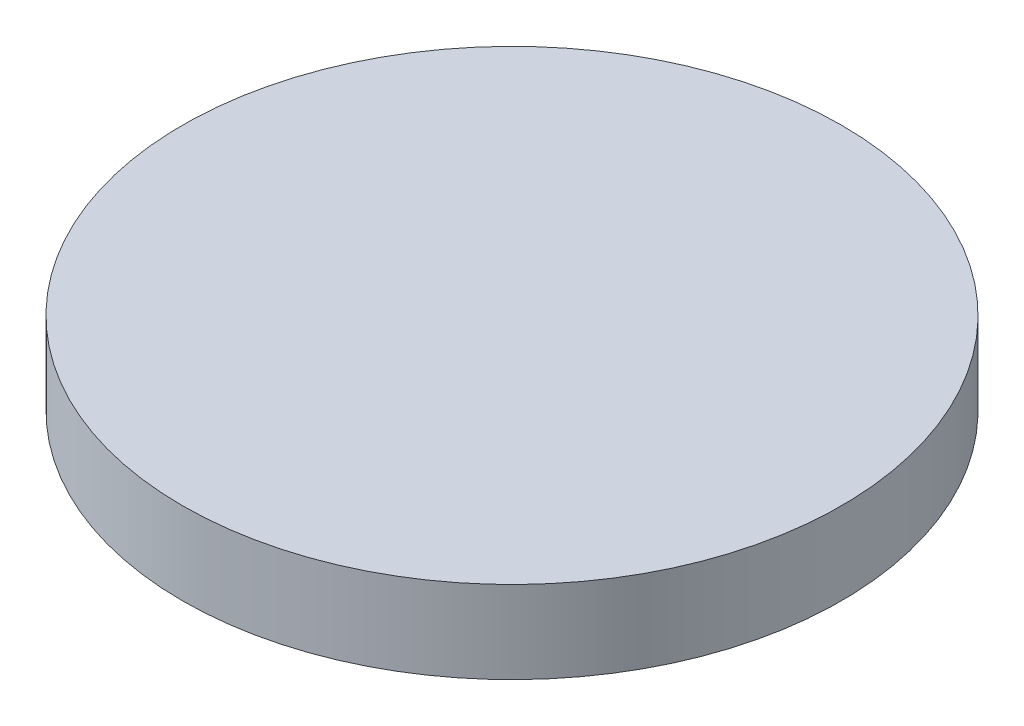
ISO-10303-21;
HEADER;
FILE_DESCRIPTION(('STEP AP214'),'2;1');
FILE_NAME('part.step','',(''),(''),'','','');
FILE_SCHEMA(('AUTOMOTIVE_DESIGN { 1 0 10303 214 1 1 1 1 }'));
ENDSEC;
DATA;
#1=APPLICATION_CONTEXT('core data for automotive mechanical design processes');
#2=APPLICATION_PROTOCOL_DEFINITION('international standard','automotive_design',2000,#1);
#3=PRODUCT_CONTEXT('',#1,'mechanical');
#4=PRODUCT('Part','Part','',(#3));
#5=PRODUCT_RELATED_PRODUCT_CATEGORY('part','',(#4));
#6=PRODUCT_DEFINITION_FORMATION('','',#4);
#7=PRODUCT_DEFINITION_CONTEXT('part definition',#1,'design');
#8=PRODUCT_DEFINITION('design','',#6,#7);
#9=PRODUCT_DEFINITION_SHAPE('','',#8);
#10=(LENGTH_UNIT() NAMED_UNIT(*) SI_UNIT(.MILLI.,.METRE.));
#11=(NAMED_UNIT(*) PLANE_ANGLE_UNIT() SI_UNIT($,.RADIAN.));
#12=(NAMED_UNIT(*) SI_UNIT($,.STERADIAN.) SOLID_ANGLE_UNIT());
#13=UNCERTAINTY_MEASURE_WITH_UNIT(LENGTH_MEASURE(1.E-05),#10,'distance_accuracy_value','');
#14=(GEOMETRIC_REPRESENTATION_CONTEXT(3) GLOBAL_UNCERTAINTY_ASSIGNED_CONTEXT((#13)) GLOBAL_UNIT_ASSIGNED_CONTEXT((#10,
#11,#12)) REPRESENTATION_CONTEXT('',''));
#15=CARTESIAN_POINT('',(0.,0.,0.));
#16=DIRECTION('',(0.,0.,1.));
#17=DIRECTION('',(1.,0.,0.));
#18=AXIS2_PLACEMENT_3D('',#15,#16,#17);
#19=CARTESIAN_POINT('',(0.,9.525,0.));
#20=DIRECTION('',(0.,-1.,0.));
#21=DIRECTION('',(0.,0.,-1.));
#22=AXIS2_PLACEMENT_3D('',#19,#20,#21);
#23=CYLINDRICAL_SURFACE('',#22,38.1);
#24=CARTESIAN_POINT('',(0.,9.525,0.));
#25=DIRECTION('',(0.,1.,0.));
#26=DIRECTION('',(0.,0.,1.));
#27=AXIS2_PLACEMENT_3D('',#24,#25,#26);
#28=CIRCLE('',#27,38.1);
#29=CARTESIAN_POINT('',(0.,9.525,-38.1));
#30=VERTEX_POINT('',#29);
#31=EDGE_CURVE('E10',#30,#30,#28,.T.);
#32=CARTESIAN_POINT('',(0.,0.,0.));
#33=DIRECTION('',(0.,1.,0.));
#34=DIRECTION('',(0.,0.,1.));
#35=AXIS2_PLACEMENT_3D('',#32,#33,#34);
#36=CIRCLE('',#35,38.1);
#37=CARTESIAN_POINT('',(0.,0.,-38.1));
#38=VERTEX_POINT('',#37);
#39=EDGE_CURVE('E33',#38,#38,#36,.T.);
#40=CARTESIAN_POINT('',(0.,9.525,-38.1));
#41=CARTESIAN_POINT('',(0.,9.42578125,-38.1));
#42=CARTESIAN_POINT('',(0.,9.3265625,-38.1));
#43=CARTESIAN_POINT('',(0.,9.128125,-38.1));
#44=CARTESIAN_POINT('',(0.,9.02890625,-38.1));
#45=CARTESIAN_POINT('',(0.,8.83046875,-38.1));
#46=CARTESIAN_POINT('',(0.,8.73125,-38.1));
#47=CARTESIAN_POINT('',(0.,8.5328125,-38.1));
#48=CARTESIAN_POINT('',(0.,8.43359375,-38.1));
#49=CARTESIAN_POINT('',(0.,8.23515625,-38.1));
#50=CARTESIAN_POINT('',(0.,8.1359375,-38.1));
#51=CARTESIAN_POINT('',(0.,7.9375,-38.1));
#52=CARTESIAN_POINT('',(0.,7.83828125,-38.1));
#53=CARTESIAN_POINT('',(0.,7.63984375,-38.1));
#54=CARTESIAN_POINT('',(0.,7.540625,-38.1));
#55=CARTESIAN_POINT('',(0.,7.3421875,-38.1));
#56=CARTESIAN_POINT('',(0.,7.24296875,-38.1));
#57=CARTESIAN_POINT('',(0.,7.04453125,-38.1));
#58=CARTESIAN_POINT('',(0.,6.9453125,-38.1));
#59=CARTESIAN_POINT('',(0.,6.746875,-38.1));
#60=CARTESIAN_POINT('',(0.,6.64765625,-38.1));
#61=CARTESIAN_POINT('',(0.,6.44921875,-38.1));
#62=CARTESIAN_POINT('',(0.,6.35,-38.1));
#63=CARTESIAN_POINT('',(0.,6.1515625,-38.1));
#64=CARTESIAN_POINT('',(0.,6.05234375,-38.1));
#65=CARTESIAN_POINT('',(0.,5.85390625,-38.1));
#66=CARTESIAN_POINT('',(0.,5.7546875,-38.1));
#67=CARTESIAN_POINT('',(0.,5.55625,-38.1));
#68=CARTESIAN_POINT('',(0.,5.45703125,-38.1));
#69=CARTESIAN_POINT('',(0.,5.25859375,-38.1));
#70=CARTESIAN_POINT('',(0.,5.159375,-38.1));
#71=CARTESIAN_POINT('',(0.,4.9609375,-38.1));
#72=CARTESIAN_POINT('',(0.,4.86171875,-38.1));
#73=CARTESIAN_POINT('',(0.,4.66328125,-38.1));
#74=CARTESIAN_POINT('',(0.,4.5640625,-38.1));
#75=CARTESIAN_POINT('',(0.,4.365625,-38.1));
#76=CARTESIAN_POINT('',(0.,4.26640625,-38.1));
#77=CARTESIAN_POINT('',(0.,4.06796875,-38.1));
#78=CARTESIAN_POINT('',(0.,3.96875,-38.1));
#79=CARTESIAN_POINT('',(0.,3.7703125,-38.1));
#80=CARTESIAN_POINT('',(0.,3.67109375,-38.1));
#81=CARTESIAN_POINT('',(0.,3.47265625,-38.1));
#82=CARTESIAN_POINT('',(0.,3.3734375,-38.1));
#83=CARTESIAN_POINT('',(0.,3.175,-38.1));
#84=CARTESIAN_POINT('',(0.,3.07578125,-38.1));
#85=CARTESIAN_POINT('',(0.,2.87734375,-38.1));
#86=CARTESIAN_POINT('',(0.,2.778125,-38.1));
#87=CARTESIAN_POINT('',(0.,2.5796875,-38.1));
#88=CARTESIAN_POINT('',(0.,2.48046875,-38.1));
#89=CARTESIAN_POINT('',(0.,2.28203125,-38.1));
#90=CARTESIAN_POINT('',(0.,2.1828125,-38.1));
#91=CARTESIAN_POINT('',(0.,1.984375,-38.1));
#92=CARTESIAN_POINT('',(0.,1.88515625,-38.1));
#93=CARTESIAN_POINT('',(0.,1.68671875,-38.1));
#94=CARTESIAN_POINT('',(0.,1.5875,-38.1));
#95=CARTESIAN_POINT('',(0.,1.3890625,-38.1));
#96=CARTESIAN_POINT('',(0.,1.28984375,-38.1));
#97=CARTESIAN_POINT('',(0.,1.09140625,-38.1));
#98=CARTESIAN_POINT('',(0.,0.992187500000001,-38.1));
#99=CARTESIAN_POINT('',(0.,0.793750000000001,-38.1));
#100=CARTESIAN_POINT('',(0.,0.69453125,-38.1));
#101=CARTESIAN_POINT('',(0.,0.49609375,-38.1));
#102=CARTESIAN_POINT('',(0.,0.396875,-38.1));
#103=CARTESIAN_POINT('',(0.,0.1984375,-38.1));
#104=CARTESIAN_POINT('',(0.,0.0992187500000001,-38.1));
#105=CARTESIAN_POINT('',(0.,0.,-38.1));
#106=B_SPLINE_CURVE_WITH_KNOTS('',3,(#40,#41,#42,#43,#44,#45,#46,#47,#48,#49,#50,#51,#52,#53,
#54,#55,#56,#57,#58,#59,#60,#61,#62,#63,#64,#65,#66,#67,#68,#69,#70,#71,#72,#73,#74,#75,#76,#77,
#78,#79,#80,#81,#82,#83,#84,#85,#86,#87,#88,#89,#90,#91,#92,#93,#94,#95,#96,#97,#98,#99,#100,
#101,#102,#103,#104,#105),.UNSPECIFIED.,.F.,.F.,(4,2,2,2,2,2,2,2,2,2,2,2,2,2,2,2,2,2,2,2,2,2,2,
2,2,2,2,2,2,2,2,2,4),(0.,0.29765625,0.5953125,0.892968750000001,1.190625,1.48828125,1.7859375,
2.08359375,2.38125,2.67890625,2.9765625,3.27421875,3.571875,3.86953125,4.1671875,4.46484375,
4.7625,5.06015625,5.3578125,5.65546875,5.953125,6.25078125,6.5484375,6.84609375,7.14375,
7.44140625,7.7390625,8.03671875,8.334375,8.63203125,8.9296875,9.22734375,9.525),.UNSPECIFIED.);
#107=EDGE_CURVE('BSEAM30',#30,#38,#106,.T.);
#108=ORIENTED_EDGE('',*,*,#31,.F.);
#109=ORIENTED_EDGE('',*,*,#39,.T.);
#110=ORIENTED_EDGE('',*,*,#107,.T.);
#111=ORIENTED_EDGE('',*,*,#107,.F.);
#112=EDGE_LOOP('',(#108,#110,#109,#111));
#113=FACE_BOUND('',#112,.T.);
#114=ADVANCED_FACE('F30',(#113),#23,.T.);
#115=CARTESIAN_POINT('',(0.,9.525,0.));
#116=DIRECTION('',(0.,1.,0.));
#117=DIRECTION('',(0.,0.,1.));
#118=AXIS2_PLACEMENT_3D('',#115,#116,#117);
#119=PLANE('',#118);
#120=ORIENTED_EDGE('',*,*,#31,.T.);
#121=EDGE_LOOP('',(#120));
#122=FACE_BOUND('',#121,.T.);
#123=ADVANCED_FACE('F45',(#122),#119,.T.);
#124=CARTESIAN_POINT('',(0.,0.,0.));
#125=DIRECTION('',(0.,1.,0.));
#126=DIRECTION('',(0.,0.,1.));
#127=AXIS2_PLACEMENT_3D('',#124,#125,#126);
#128=PLANE('',#127);
#129=ORIENTED_EDGE('',*,*,#39,.F.);
#130=EDGE_LOOP('',(#129));
#131=FACE_BOUND('',#130,.T.);
#132=ADVANCED_FACE('F43',(#131),#128,.F.);
#133=CLOSED_SHELL('',(#114,#123,#132));
#134=MANIFOLD_SOLID_BREP('B2',#133);
#135=ADVANCED_BREP_SHAPE_REPRESENTATION('',(#18,#134),#14);
#136=SHAPE_DEFINITION_REPRESENTATION(#9,#135);
ENDSEC;
END-ISO-10303-21;
